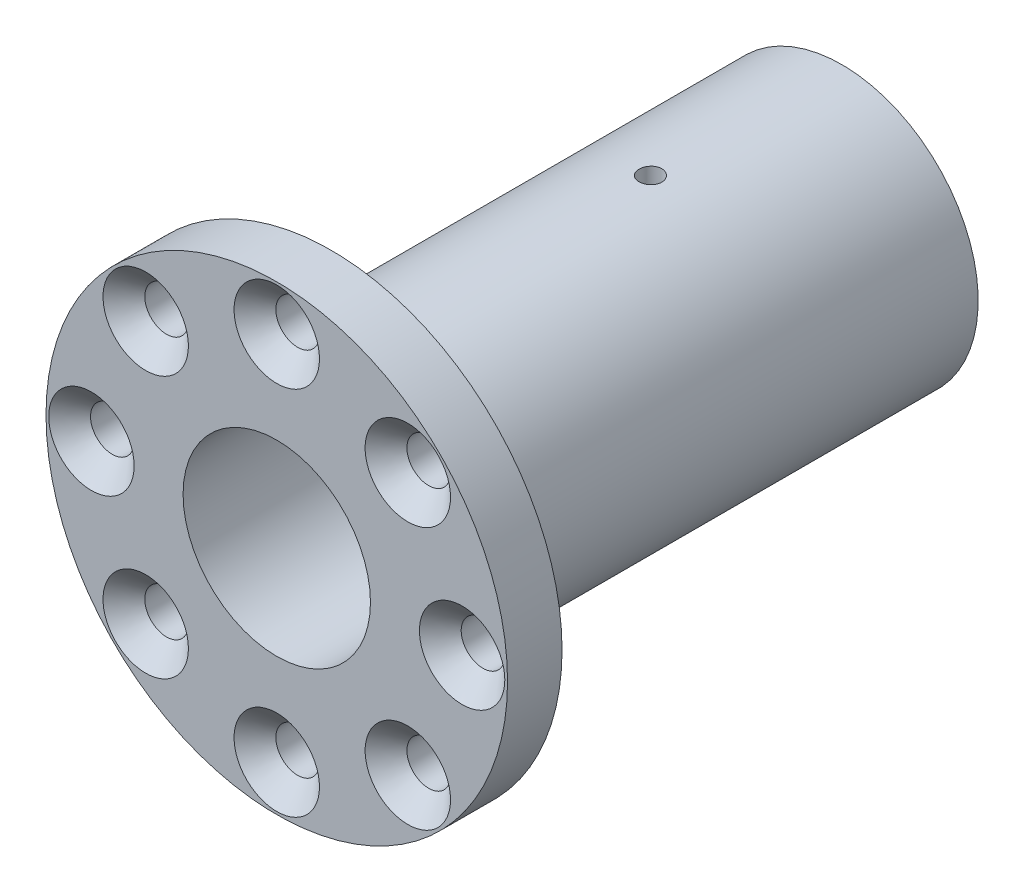
ISO-10303-21;
HEADER;
FILE_DESCRIPTION(('STEP AP214'),'2;1');
FILE_NAME('part.step','',(''),(''),'','','');
FILE_SCHEMA(('AUTOMOTIVE_DESIGN { 1 0 10303 214 1 1 1 1 }'));
ENDSEC;
DATA;
#1=APPLICATION_CONTEXT('core data for automotive mechanical design processes');
#2=APPLICATION_PROTOCOL_DEFINITION('international standard','automotive_design',2000,#1);
#3=PRODUCT_CONTEXT('',#1,'mechanical');
#4=PRODUCT('Part','Part','',(#3));
#5=PRODUCT_RELATED_PRODUCT_CATEGORY('part','',(#4));
#6=PRODUCT_DEFINITION_FORMATION('','',#4);
#7=PRODUCT_DEFINITION_CONTEXT('part definition',#1,'design');
#8=PRODUCT_DEFINITION('design','',#6,#7);
#9=PRODUCT_DEFINITION_SHAPE('','',#8);
#10=(LENGTH_UNIT() NAMED_UNIT(*) SI_UNIT(.MILLI.,.METRE.));
#11=(NAMED_UNIT(*) PLANE_ANGLE_UNIT() SI_UNIT($,.RADIAN.));
#12=(NAMED_UNIT(*) SI_UNIT($,.STERADIAN.) SOLID_ANGLE_UNIT());
#13=UNCERTAINTY_MEASURE_WITH_UNIT(LENGTH_MEASURE(1.E-05),#10,'distance_accuracy_value','');
#14=(GEOMETRIC_REPRESENTATION_CONTEXT(3) GLOBAL_UNCERTAINTY_ASSIGNED_CONTEXT((#13)) GLOBAL_UNIT_ASSIGNED_CONTEXT((#10,
#11,#12)) REPRESENTATION_CONTEXT('',''));
#15=CARTESIAN_POINT('',(0.,0.,0.));
#16=DIRECTION('',(0.,0.,1.));
#17=DIRECTION('',(1.,0.,0.));
#18=AXIS2_PLACEMENT_3D('',#15,#16,#17);
#19=CARTESIAN_POINT('',(0.,0.,61.54));
#20=DIRECTION('',(0.,0.,-1.));
#21=DIRECTION('',(-1.,0.,0.));
#22=AXIS2_PLACEMENT_3D('',#19,#20,#21);
#23=CYLINDRICAL_SURFACE('',#22,25.4);
#24=CARTESIAN_POINT('',(0.,0.,61.54));
#25=DIRECTION('',(0.,0.,-1.));
#26=DIRECTION('',(-1.,0.,0.));
#27=AXIS2_PLACEMENT_3D('',#24,#25,#26);
#28=CIRCLE('',#27,25.4);
#29=CARTESIAN_POINT('',(-25.4,0.,61.54));
#30=VERTEX_POINT('',#29);
#31=EDGE_CURVE('E51',#30,#30,#28,.T.);
#32=ORIENTED_EDGE('',*,*,#31,.T.);
#33=EDGE_LOOP('',(#32));
#34=FACE_BOUND('',#33,.T.);
#35=CARTESIAN_POINT('',(0.,0.,55.54));
#36=DIRECTION('',(0.,0.,-1.));
#37=DIRECTION('',(-1.,0.,0.));
#38=AXIS2_PLACEMENT_3D('',#35,#36,#37);
#39=CIRCLE('',#38,25.4);
#40=CARTESIAN_POINT('',(-25.4,0.,55.54));
#41=VERTEX_POINT('',#40);
#42=EDGE_CURVE('E218',#41,#41,#39,.T.);
#43=ORIENTED_EDGE('',*,*,#42,.F.);
#44=EDGE_LOOP('',(#43));
#45=FACE_BOUND('',#44,.T.);
#46=ADVANCED_FACE('F42',(#34,#45),#23,.T.);
#47=CARTESIAN_POINT('',(25.4,0.,61.54));
#48=DIRECTION('',(0.,0.,1.));
#49=DIRECTION('',(1.,0.,0.));
#50=AXIS2_PLACEMENT_3D('',#47,#48,#49);
#51=PLANE('',#50);
#52=CARTESIAN_POINT('',(0.,20.4,61.54));
#53=DIRECTION('',(0.,0.,1.));
#54=DIRECTION('',(1.,0.,0.));
#55=AXIS2_PLACEMENT_3D('',#52,#53,#54);
#56=CIRCLE('',#55,4.7);
#57=CARTESIAN_POINT('',(4.7,20.4,61.54));
#58=VERTEX_POINT('',#57);
#59=EDGE_CURVE('E391',#58,#58,#56,.T.);
#60=ORIENTED_EDGE('',*,*,#59,.F.);
#61=EDGE_LOOP('',(#60));
#62=FACE_BOUND('',#61,.T.);
#63=CARTESIAN_POINT('',(14.4249783362061,14.4249783362068,61.54));
#64=DIRECTION('',(0.,0.,1.));
#65=DIRECTION('',(1.,0.,0.));
#66=AXIS2_PLACEMENT_3D('',#63,#64,#65);
#67=CIRCLE('',#66,4.7);
#68=CARTESIAN_POINT('',(19.1249783362061,14.4249783362068,61.54));
#69=VERTEX_POINT('',#68);
#70=EDGE_CURVE('E384',#69,#69,#67,.T.);
#71=ORIENTED_EDGE('',*,*,#70,.F.);
#72=EDGE_LOOP('',(#71));
#73=FACE_BOUND('',#72,.T.);
#74=CARTESIAN_POINT('',(20.4000000000017,1.73691033767046E-12,61.54));
#75=DIRECTION('',(0.,0.,1.));
#76=DIRECTION('',(1.,0.,0.));
#77=AXIS2_PLACEMENT_3D('',#74,#75,#76);
#78=CIRCLE('',#77,4.7);
#79=CARTESIAN_POINT('',(25.1000000000017,1.73691033767046E-12,61.54));
#80=VERTEX_POINT('',#79);
#81=EDGE_CURVE('E376',#80,#80,#78,.T.);
#82=ORIENTED_EDGE('',*,*,#81,.F.);
#83=EDGE_LOOP('',(#82));
#84=FACE_BOUND('',#83,.T.);
#85=CARTESIAN_POINT('',(14.4249783362085,-14.4249783362043,61.54));
#86=DIRECTION('',(0.,0.,1.));
#87=DIRECTION('',(1.,0.,0.));
#88=AXIS2_PLACEMENT_3D('',#85,#86,#87);
#89=CIRCLE('',#88,4.7);
#90=CARTESIAN_POINT('',(19.1249783362085,-14.4249783362043,61.54));
#91=VERTEX_POINT('',#90);
#92=EDGE_CURVE('E368',#91,#91,#89,.T.);
#93=ORIENTED_EDGE('',*,*,#92,.F.);
#94=EDGE_LOOP('',(#93));
#95=FACE_BOUND('',#94,.T.);
#96=CARTESIAN_POINT('',(3.47378376064356E-12,-20.4,61.54));
#97=DIRECTION('',(0.,0.,1.));
#98=DIRECTION('',(1.,0.,0.));
#99=AXIS2_PLACEMENT_3D('',#96,#97,#98);
#100=CIRCLE('',#99,4.7);
#101=CARTESIAN_POINT('',(4.70000000000347,-20.4,61.54));
#102=VERTEX_POINT('',#101);
#103=EDGE_CURVE('E361',#102,#102,#100,.T.);
#104=ORIENTED_EDGE('',*,*,#103,.F.);
#105=EDGE_LOOP('',(#104));
#106=FACE_BOUND('',#105,.T.);
#107=CARTESIAN_POINT('',(-14.4249783362026,-14.4249783362068,61.54));
#108=DIRECTION('',(0.,0.,1.));
#109=DIRECTION('',(1.,0.,0.));
#110=AXIS2_PLACEMENT_3D('',#107,#108,#109);
#111=CIRCLE('',#110,4.7);
#112=CARTESIAN_POINT('',(-9.7249783362026,-14.4249783362068,61.54));
#113=VERTEX_POINT('',#112);
#114=EDGE_CURVE('E353',#113,#113,#111,.T.);
#115=ORIENTED_EDGE('',*,*,#114,.F.);
#116=EDGE_LOOP('',(#115));
#117=FACE_BOUND('',#116,.T.);
#118=CARTESIAN_POINT('',(-20.3999999999983,-1.73940861714072E-12,61.54));
#119=DIRECTION('',(0.,0.,1.));
#120=DIRECTION('',(1.,0.,0.));
#121=AXIS2_PLACEMENT_3D('',#118,#119,#120);
#122=CIRCLE('',#121,4.7);
#123=CARTESIAN_POINT('',(-15.6999999999983,-1.73940861714072E-12,61.54));
#124=VERTEX_POINT('',#123);
#125=EDGE_CURVE('E345',#124,#124,#122,.T.);
#126=ORIENTED_EDGE('',*,*,#125,.F.);
#127=EDGE_LOOP('',(#126));
#128=FACE_BOUND('',#127,.T.);
#129=CARTESIAN_POINT('',(-14.4249783362051,14.4249783362043,61.54));
#130=DIRECTION('',(0.,0.,1.));
#131=DIRECTION('',(1.,0.,0.));
#132=AXIS2_PLACEMENT_3D('',#129,#130,#131);
#133=CIRCLE('',#132,4.7);
#134=CARTESIAN_POINT('',(-9.72497833620506,14.4249783362043,61.54));
#135=VERTEX_POINT('',#134);
#136=EDGE_CURVE('E333',#135,#135,#133,.T.);
#137=ORIENTED_EDGE('',*,*,#136,.F.);
#138=EDGE_LOOP('',(#137));
#139=FACE_BOUND('',#138,.T.);
#140=CARTESIAN_POINT('',(0.,0.,61.54));
#141=DIRECTION('',(0.,0.,1.));
#142=DIRECTION('',(1.,0.,0.));
#143=AXIS2_PLACEMENT_3D('',#140,#141,#142);
#144=CIRCLE('',#143,10.3124);
#145=CARTESIAN_POINT('',(10.3124,0.,61.54));
#146=VERTEX_POINT('',#145);
#147=EDGE_CURVE('E177',#146,#146,#144,.T.);
#148=ORIENTED_EDGE('',*,*,#147,.F.);
#149=EDGE_LOOP('',(#148));
#150=FACE_BOUND('',#149,.T.);
#151=ORIENTED_EDGE('',*,*,#31,.F.);
#152=EDGE_LOOP('',(#151));
#153=FACE_BOUND('',#152,.T.);
#154=ADVANCED_FACE('F280',(#62,#73,#84,#95,#106,#117,#128,#139,#150,#153),#51,.T.);
#155=CARTESIAN_POINT('',(0.,0.,55.54));
#156=DIRECTION('',(0.,0.,-1.));
#157=DIRECTION('',(-1.,0.,0.));
#158=AXIS2_PLACEMENT_3D('',#155,#156,#157);
#159=PLANE('',#158);
#160=CARTESIAN_POINT('',(0.,20.4,55.54));
#161=DIRECTION('',(0.,0.,-1.));
#162=DIRECTION('',(-1.,0.,0.));
#163=AXIS2_PLACEMENT_3D('',#160,#161,#162);
#164=CIRCLE('',#163,2.39999999999999);
#165=CARTESIAN_POINT('',(-2.39999999999999,20.4,55.54));
#166=VERTEX_POINT('',#165);
#167=EDGE_CURVE('E45',#166,#166,#164,.T.);
#168=ORIENTED_EDGE('',*,*,#167,.F.);
#169=EDGE_LOOP('',(#168));
#170=FACE_BOUND('',#169,.T.);
#171=CARTESIAN_POINT('',(14.4249783362061,14.4249783362068,55.54));
#172=DIRECTION('',(0.,0.,-1.));
#173=DIRECTION('',(-1.,0.,0.));
#174=AXIS2_PLACEMENT_3D('',#171,#172,#173);
#175=CIRCLE('',#174,2.39999999999999);
#176=CARTESIAN_POINT('',(12.0249783362061,14.4249783362068,55.54));
#177=VERTEX_POINT('',#176);
#178=EDGE_CURVE('E300',#177,#177,#175,.T.);
#179=ORIENTED_EDGE('',*,*,#178,.F.);
#180=EDGE_LOOP('',(#179));
#181=FACE_BOUND('',#180,.T.);
#182=CARTESIAN_POINT('',(20.4000000000017,1.73691033767046E-12,55.54));
#183=DIRECTION('',(0.,0.,-1.));
#184=DIRECTION('',(-1.,0.,0.));
#185=AXIS2_PLACEMENT_3D('',#182,#183,#184);
#186=CIRCLE('',#185,2.39999999999999);
#187=CARTESIAN_POINT('',(18.0000000000017,1.73691033767046E-12,55.54));
#188=VERTEX_POINT('',#187);
#189=EDGE_CURVE('E304',#188,#188,#186,.T.);
#190=ORIENTED_EDGE('',*,*,#189,.F.);
#191=EDGE_LOOP('',(#190));
#192=FACE_BOUND('',#191,.T.);
#193=CARTESIAN_POINT('',(14.4249783362085,-14.4249783362043,55.54));
#194=DIRECTION('',(0.,0.,-1.));
#195=DIRECTION('',(-1.,0.,0.));
#196=AXIS2_PLACEMENT_3D('',#193,#194,#195);
#197=CIRCLE('',#196,2.39999999999999);
#198=CARTESIAN_POINT('',(12.0249783362085,-14.4249783362043,55.54));
#199=VERTEX_POINT('',#198);
#200=EDGE_CURVE('E308',#199,#199,#197,.T.);
#201=ORIENTED_EDGE('',*,*,#200,.F.);
#202=EDGE_LOOP('',(#201));
#203=FACE_BOUND('',#202,.T.);
#204=CARTESIAN_POINT('',(3.47378376064356E-12,-20.4,55.54));
#205=DIRECTION('',(0.,0.,-1.));
#206=DIRECTION('',(-1.,0.,0.));
#207=AXIS2_PLACEMENT_3D('',#204,#205,#206);
#208=CIRCLE('',#207,2.39999999999999);
#209=CARTESIAN_POINT('',(-2.39999999999651,-20.4,55.54));
#210=VERTEX_POINT('',#209);
#211=EDGE_CURVE('E312',#210,#210,#208,.T.);
#212=ORIENTED_EDGE('',*,*,#211,.F.);
#213=EDGE_LOOP('',(#212));
#214=FACE_BOUND('',#213,.T.);
#215=CARTESIAN_POINT('',(-14.4249783362026,-14.4249783362068,55.54));
#216=DIRECTION('',(0.,0.,-1.));
#217=DIRECTION('',(-1.,0.,0.));
#218=AXIS2_PLACEMENT_3D('',#215,#216,#217);
#219=CIRCLE('',#218,2.39999999999999);
#220=CARTESIAN_POINT('',(-16.8249783362026,-14.4249783362068,55.54));
#221=VERTEX_POINT('',#220);
#222=EDGE_CURVE('E316',#221,#221,#219,.T.);
#223=ORIENTED_EDGE('',*,*,#222,.F.);
#224=EDGE_LOOP('',(#223));
#225=FACE_BOUND('',#224,.T.);
#226=CARTESIAN_POINT('',(-20.3999999999983,-1.73940861714072E-12,55.54));
#227=DIRECTION('',(0.,0.,-1.));
#228=DIRECTION('',(-1.,0.,0.));
#229=AXIS2_PLACEMENT_3D('',#226,#227,#228);
#230=CIRCLE('',#229,2.39999999999999);
#231=CARTESIAN_POINT('',(-22.7999999999983,-1.73940861714072E-12,55.54));
#232=VERTEX_POINT('',#231);
#233=EDGE_CURVE('E320',#232,#232,#230,.T.);
#234=ORIENTED_EDGE('',*,*,#233,.F.);
#235=EDGE_LOOP('',(#234));
#236=FACE_BOUND('',#235,.T.);
#237=CARTESIAN_POINT('',(-14.4249783362051,14.4249783362043,55.54));
#238=DIRECTION('',(0.,0.,-1.));
#239=DIRECTION('',(-1.,0.,0.));
#240=AXIS2_PLACEMENT_3D('',#237,#238,#239);
#241=CIRCLE('',#240,2.39999999999999);
#242=CARTESIAN_POINT('',(-16.824978336205,14.4249783362043,55.54));
#243=VERTEX_POINT('',#242);
#244=EDGE_CURVE('E126',#243,#243,#241,.T.);
#245=ORIENTED_EDGE('',*,*,#244,.F.);
#246=EDGE_LOOP('',(#245));
#247=FACE_BOUND('',#246,.T.);
#248=CARTESIAN_POINT('',(0.,0.,55.54));
#249=DIRECTION('',(0.,0.,-1.));
#250=DIRECTION('',(-1.,0.,0.));
#251=AXIS2_PLACEMENT_3D('',#248,#249,#250);
#252=CIRCLE('',#251,15.);
#253=CARTESIAN_POINT('',(-15.,0.,55.54));
#254=VERTEX_POINT('',#253);
#255=EDGE_CURVE('E11',#254,#254,#252,.T.);
#256=ORIENTED_EDGE('',*,*,#255,.F.);
#257=EDGE_LOOP('',(#256));
#258=FACE_BOUND('',#257,.T.);
#259=ORIENTED_EDGE('',*,*,#42,.T.);
#260=EDGE_LOOP('',(#259));
#261=FACE_BOUND('',#260,.T.);
#262=ADVANCED_FACE('F275',(#170,#181,#192,#203,#214,#225,#236,#247,#258,#261),#159,.T.);
#263=CARTESIAN_POINT('',(0.,0.,-0.660000000000001));
#264=DIRECTION('',(0.,0.,1.));
#265=DIRECTION('',(1.,0.,0.));
#266=AXIS2_PLACEMENT_3D('',#263,#264,#265);
#267=CYLINDRICAL_SURFACE('',#266,15.);
#268=CARTESIAN_POINT('',(0.,15.,19.172));
#269=CARTESIAN_POINT('',(0.070082612401505,14.999999317644,19.1720030610329));
#270=CARTESIAN_POINT('',(0.140212933975281,14.9995036067925,19.1779137122638));
#271=CARTESIAN_POINT('',(0.278533213375486,14.9975737791031,19.2014054398189));
#272=CARTESIAN_POINT('',(0.346720881531537,14.9961385991462,19.2189997378811));
#273=CARTESIAN_POINT('',(0.479132528142825,14.9924920155763,19.2653464422617));
#274=CARTESIAN_POINT('',(0.543358725530768,14.9902810512311,19.2940925351373));
#275=CARTESIAN_POINT('',(0.666059041770093,14.9853308468089,19.36191553984));
#276=CARTESIAN_POINT('',(0.724534387356734,14.982591719767,19.4009902418469));
#277=CARTESIAN_POINT('',(0.834237499956986,14.9768847483339,19.4884688332575));
#278=CARTESIAN_POINT('',(0.885448590520199,14.9739164010822,19.5368936049196));
#279=CARTESIAN_POINT('',(0.97902641692069,14.9680897600396,19.6416536198124));
#280=CARTESIAN_POINT('',(1.02139276421438,14.965231471088,19.6979892103783));
#281=CARTESIAN_POINT('',(1.09613490298778,14.9599431582655,19.8170726463738));
#282=CARTESIAN_POINT('',(1.12849604118943,14.9575137647512,19.8798297192535));
#283=CARTESIAN_POINT('',(1.1822155422173,14.9533640556034,20.009910369445));
#284=CARTESIAN_POINT('',(1.20357409939052,14.9516437274454,20.0772338660728));
#285=CARTESIAN_POINT('',(1.23463378727321,14.949111150829,20.2143692398515));
#286=CARTESIAN_POINT('',(1.24436208173721,14.9482967867028,20.2841749249908));
#287=CARTESIAN_POINT('',(1.25196901001928,14.9476616540185,20.4244327549317));
#288=CARTESIAN_POINT('',(1.24984786622442,14.9478408668133,20.4948848875763));
#289=CARTESIAN_POINT('',(1.23383858026856,14.9491707170205,20.6342495818882));
#290=CARTESIAN_POINT('',(1.21997996004757,14.9503189172232,20.7031655613455));
#291=CARTESIAN_POINT('',(1.18093498172867,14.9534535446171,20.8376898342412));
#292=CARTESIAN_POINT('',(1.15574851299598,14.955439979995,20.9032980953673));
#293=CARTESIAN_POINT('',(1.09472973519004,14.9600300588357,21.0294386323476));
#294=CARTESIAN_POINT('',(1.05888418094649,14.9626344693871,21.0899644719844));
#295=CARTESIAN_POINT('',(0.977574304891683,14.9681663357985,21.2041516735248));
#296=CARTESIAN_POINT('',(0.932109788278176,14.9710937982004,21.2578128963715));
#297=CARTESIAN_POINT('',(0.832686977782953,14.9769527551456,21.356919274102));
#298=CARTESIAN_POINT('',(0.778703161738219,14.9798842346883,21.4023388301616));
#299=CARTESIAN_POINT('',(0.663863195464689,14.9854123983729,21.4834746542357));
#300=CARTESIAN_POINT('',(0.603007040644173,14.9880090822911,21.5191909157669));
#301=CARTESIAN_POINT('',(0.476133241584815,14.9925755726205,21.5799047033359));
#302=CARTESIAN_POINT('',(0.410115052261343,14.9945453127181,21.6049010955977));
#303=CARTESIAN_POINT('',(0.274798836274477,14.9976352176475,21.6434476655642));
#304=CARTESIAN_POINT('',(0.205500877711069,14.9987554001111,21.6569980808191));
#305=CARTESIAN_POINT('',(0.0658141252053148,15.0000177117881,21.672235955052));
#306=CARTESIAN_POINT('',(-0.00457078639399386,15.00016275615,21.6739587726336));
#307=CARTESIAN_POINT('',(-0.144628440629128,14.9994662347338,21.6655851742159));
#308=CARTESIAN_POINT('',(-0.214301189901765,14.9986246781584,21.6554888684632));
#309=CARTESIAN_POINT('',(-0.350855945280873,14.9960514730165,21.6237929267374));
#310=CARTESIAN_POINT('',(-0.417741781424651,14.9943210927178,21.6022096799677));
#311=CARTESIAN_POINT('',(-0.54694270635311,14.9901646264044,21.5481692652725));
#312=CARTESIAN_POINT('',(-0.609257722853913,14.9877385293905,21.5157119254269));
#313=CARTESIAN_POINT('',(-0.727709022877381,14.9824553299204,21.4407558134796));
#314=CARTESIAN_POINT('',(-0.783830438151834,14.9795972277342,21.3982336170065));
#315=CARTESIAN_POINT('',(-0.888151368554523,14.9737744829962,21.3043886786869));
#316=CARTESIAN_POINT('',(-0.936350746017976,14.9708098385941,21.2530657839384));
#317=CARTESIAN_POINT('',(-1.02358068181887,14.9650995151978,21.1429228847521));
#318=CARTESIAN_POINT('',(-1.06258816654204,14.9623543984278,21.0840845735033));
#319=CARTESIAN_POINT('',(-1.13016882854939,14.957401896804,20.9606721714207));
#320=CARTESIAN_POINT('',(-1.15874211001245,14.9551945065815,20.8960981378626));
#321=CARTESIAN_POINT('',(-1.2046039718007,14.9515705356118,20.763129011826));
#322=CARTESIAN_POINT('',(-1.22190667681161,14.9501529653579,20.6947388191071));
#323=CARTESIAN_POINT('',(-1.24478221238769,14.9482658211357,20.556011625157));
#324=CARTESIAN_POINT('',(-1.25035526821033,14.9477962289621,20.485674661338));
#325=CARTESIAN_POINT('',(-1.24961070361366,14.9478584743774,20.3452798424739));
#326=CARTESIAN_POINT('',(-1.24332933722173,14.9483872586634,20.2752217909545));
#327=CARTESIAN_POINT('',(-1.21912982911878,14.9503801885288,20.1371593330614));
#328=CARTESIAN_POINT('',(-1.20121166965953,14.951844335535,20.0691549298202));
#329=CARTESIAN_POINT('',(-1.15425638752133,14.9555422141463,19.9371277959167));
#330=CARTESIAN_POINT('',(-1.12521991750816,14.9577759005774,19.8731048317929));
#331=CARTESIAN_POINT('',(-1.05685632368406,14.9627612484384,19.7508364492829));
#332=CARTESIAN_POINT('',(-1.0175293613932,14.9655129017381,19.6925909402333));
#333=CARTESIAN_POINT('',(-0.929564927653057,14.9712341462335,19.5833453262337));
#334=CARTESIAN_POINT('',(-0.880900617176821,14.9742043500718,19.5323668641783));
#335=CARTESIAN_POINT('',(-0.77569153199058,14.980022437621,19.4392810184959));
#336=CARTESIAN_POINT('',(-0.719144853301364,14.9828702915603,19.39717578438));
#337=CARTESIAN_POINT('',(-0.599667216286769,14.9881279355284,19.3229751744781));
#338=CARTESIAN_POINT('',(-0.536724570338173,14.9905369002888,19.2908985766796));
#339=CARTESIAN_POINT('',(-0.406369689994666,14.9946356564538,19.2378102461859));
#340=CARTESIAN_POINT('',(-0.338962694267062,14.9963262741032,19.2167857946399));
#341=CARTESIAN_POINT('',(-0.225965060120847,14.9983638466731,19.1917530218724));
#342=CARTESIAN_POINT('',(-0.181101118048087,14.9989746109619,19.1843554843531));
#343=CARTESIAN_POINT('',(-0.0908314643764523,14.9997929082329,19.1744779879035));
#344=CARTESIAN_POINT('',(-0.0454257542163058,15.0000004422857,19.1719980159169));
#345=CARTESIAN_POINT('',(0.,15.,19.172));
#346=B_SPLINE_CURVE_WITH_KNOTS('',3,(#268,#269,#270,#271,#272,#273,#274,#275,#276,#277,#278,
#279,#280,#281,#282,#283,#284,#285,#286,#287,#288,#289,#290,#291,#292,#293,#294,#295,#296,#297,
#298,#299,#300,#301,#302,#303,#304,#305,#306,#307,#308,#309,#310,#311,#312,#313,#314,#315,#316,
#317,#318,#319,#320,#321,#322,#323,#324,#325,#326,#327,#328,#329,#330,#331,#332,#333,#334,#335,
#336,#337,#338,#339,#340,#341,#342,#343,#344,#345),.UNSPECIFIED.,.T.,.F.,(4,2,2,2,2,2,2,2,2,2,2,
2,2,2,2,2,2,2,2,2,2,2,2,2,2,2,2,2,2,2,2,2,2,2,2,2,2,2,4),(0.,0.210081983500173,
0.420402111247292,0.630603342361191,0.840759636980224,1.05139083598221,1.26203128592414,
1.47297878688864,1.68392256159875,1.89437268539483,2.10481885953273,2.31473728887862,
2.52465776846248,2.73484019686123,2.94502688226074,3.15585563668936,3.36668453198305,
3.57753571988062,3.78838253165668,3.9985987413396,4.20881299017775,4.4187281128848,
4.62864655451714,4.83905843718657,5.04947397589062,5.26041220614001,5.47134833024784,
5.68201959051159,5.89268680498446,6.10271078603158,6.31273508740423,6.52274706184401,
6.73275574012318,6.94337735830797,7.15404994040599,7.3651146632819,7.5759359573973,
7.71210607945825,7.8482758399843),.UNSPECIFIED.);
#347=CARTESIAN_POINT('',(0.,15.,19.172));
#348=VERTEX_POINT('',#347);
#349=EDGE_CURVE('E168',#348,#348,#346,.T.);
#350=ORIENTED_EDGE('',*,*,#349,.T.);
#351=EDGE_LOOP('',(#350));
#352=FACE_BOUND('',#351,.T.);
#353=CARTESIAN_POINT('',(0.,0.,-0.660000000000001));
#354=DIRECTION('',(0.,0.,-1.));
#355=DIRECTION('',(-1.,0.,0.));
#356=AXIS2_PLACEMENT_3D('',#353,#354,#355);
#357=CIRCLE('',#356,15.);
#358=CARTESIAN_POINT('',(-15.,0.,-0.660000000000001));
#359=VERTEX_POINT('',#358);
#360=EDGE_CURVE('E207',#359,#359,#357,.T.);
#361=ORIENTED_EDGE('',*,*,#360,.F.);
#362=EDGE_LOOP('',(#361));
#363=FACE_BOUND('',#362,.T.);
#364=ORIENTED_EDGE('',*,*,#255,.T.);
#365=EDGE_LOOP('',(#364));
#366=FACE_BOUND('',#365,.T.);
#367=ADVANCED_FACE('F235',(#352,#363,#366),#267,.T.);
#368=CARTESIAN_POINT('',(0.,0.,-0.660000000000001));
#369=DIRECTION('',(0.,0.,-1.));
#370=DIRECTION('',(-1.,0.,0.));
#371=AXIS2_PLACEMENT_3D('',#368,#369,#370);
#372=PLANE('',#371);
#373=CARTESIAN_POINT('',(11.4999999999991,-7.61616736356426E-13,-0.660000000000001));
#374=DIRECTION('',(0.,0.,-1.));
#375=DIRECTION('',(-1.,0.,0.));
#376=AXIS2_PLACEMENT_3D('',#373,#374,#375);
#377=CIRCLE('',#376,1.25);
#378=CARTESIAN_POINT('',(10.2499999999991,-7.61616736356426E-13,-0.660000000000001));
#379=VERTEX_POINT('',#378);
#380=EDGE_CURVE('E115',#379,#379,#377,.T.);
#381=ORIENTED_EDGE('',*,*,#380,.F.);
#382=EDGE_LOOP('',(#381));
#383=FACE_BOUND('',#382,.T.);
#384=CARTESIAN_POINT('',(5.74999999999794,-9.95929214352135,-0.660000000000001));
#385=DIRECTION('',(0.,0.,-1.));
#386=DIRECTION('',(-1.,0.,0.));
#387=AXIS2_PLACEMENT_3D('',#384,#385,#386);
#388=CIRCLE('',#387,1.25);
#389=CARTESIAN_POINT('',(4.49999999999794,-9.95929214352135,-0.660000000000001));
#390=VERTEX_POINT('',#389);
#391=EDGE_CURVE('E114',#390,#390,#388,.T.);
#392=ORIENTED_EDGE('',*,*,#391,.F.);
#393=EDGE_LOOP('',(#392));
#394=FACE_BOUND('',#393,.T.);
#395=CARTESIAN_POINT('',(-5.75000000000222,-9.95929214352015,-0.660000000000001));
#396=DIRECTION('',(0.,0.,-1.));
#397=DIRECTION('',(-1.,0.,0.));
#398=AXIS2_PLACEMENT_3D('',#395,#396,#397);
#399=CIRCLE('',#398,1.25);
#400=CARTESIAN_POINT('',(-7.00000000000222,-9.95929214352015,-0.660000000000001));
#401=VERTEX_POINT('',#400);
#402=EDGE_CURVE('E133',#401,#401,#399,.T.);
#403=ORIENTED_EDGE('',*,*,#402,.F.);
#404=EDGE_LOOP('',(#403));
#405=FACE_BOUND('',#404,.T.);
#406=CARTESIAN_POINT('',(-11.5000000000013,1.64225995095778E-12,-0.660000000000001));
#407=DIRECTION('',(0.,0.,-1.));
#408=DIRECTION('',(-1.,0.,0.));
#409=AXIS2_PLACEMENT_3D('',#406,#407,#408);
#410=CIRCLE('',#409,1.25);
#411=CARTESIAN_POINT('',(-12.7500000000013,1.64225995095778E-12,-0.660000000000001));
#412=VERTEX_POINT('',#411);
#413=EDGE_CURVE('E141',#412,#412,#410,.T.);
#414=ORIENTED_EDGE('',*,*,#413,.F.);
#415=EDGE_LOOP('',(#414));
#416=FACE_BOUND('',#415,.T.);
#417=CARTESIAN_POINT('',(-5.75000000000015,9.95929214352223,-0.660000000000001));
#418=DIRECTION('',(0.,0.,-1.));
#419=DIRECTION('',(-1.,0.,0.));
#420=AXIS2_PLACEMENT_3D('',#417,#418,#419);
#421=CIRCLE('',#420,1.25);
#422=CARTESIAN_POINT('',(-7.00000000000015,9.95929214352223,-0.660000000000001));
#423=VERTEX_POINT('',#422);
#424=EDGE_CURVE('E149',#423,#423,#421,.T.);
#425=ORIENTED_EDGE('',*,*,#424,.F.);
#426=EDGE_LOOP('',(#425));
#427=FACE_BOUND('',#426,.T.);
#428=CARTESIAN_POINT('',(5.75000000000002,9.95929214352104,-0.660000000000001));
#429=DIRECTION('',(0.,0.,-1.));
#430=DIRECTION('',(-1.,0.,0.));
#431=AXIS2_PLACEMENT_3D('',#428,#429,#430);
#432=CIRCLE('',#431,1.25);
#433=CARTESIAN_POINT('',(4.50000000000002,9.95929214352104,-0.660000000000001));
#434=VERTEX_POINT('',#433);
#435=EDGE_CURVE('E156',#434,#434,#432,.T.);
#436=ORIENTED_EDGE('',*,*,#435,.F.);
#437=EDGE_LOOP('',(#436));
#438=FACE_BOUND('',#437,.T.);
#439=CARTESIAN_POINT('',(0.,0.,-0.660000000000001));
#440=DIRECTION('',(0.,0.,1.));
#441=DIRECTION('',(1.,0.,0.));
#442=AXIS2_PLACEMENT_3D('',#439,#440,#441);
#443=CIRCLE('',#442,7.01039999999999);
#444=CARTESIAN_POINT('',(-2.5,6.54948151841044,-0.660000000000001));
#445=VERTEX_POINT('',#444);
#446=CARTESIAN_POINT('',(2.5,6.54948151841044,-0.660000000000001));
#447=VERTEX_POINT('',#446);
#448=EDGE_CURVE('E181',#445,#447,#443,.T.);
#449=ORIENTED_EDGE('',*,*,#448,.T.);
#450=DIRECTION('',(0.,-1.,0.));
#451=VECTOR('',#450,1.);
#452=CARTESIAN_POINT('',(2.5,9.05849989544415,-0.660000000000001));
#453=LINE('',#452,#451);
#454=CARTESIAN_POINT('',(2.5,9.05849989544415,-0.660000000000001));
#455=VERTEX_POINT('',#454);
#456=EDGE_CURVE('E188',#455,#447,#453,.T.);
#457=ORIENTED_EDGE('',*,*,#456,.F.);
#458=DIRECTION('',(1.,0.,0.));
#459=VECTOR('',#458,1.);
#460=CARTESIAN_POINT('',(-2.5,9.05849989544415,-0.660000000000001));
#461=LINE('',#460,#459);
#462=CARTESIAN_POINT('',(-2.5,9.05849989544415,-0.660000000000001));
#463=VERTEX_POINT('',#462);
#464=EDGE_CURVE('E197',#463,#455,#461,.T.);
#465=ORIENTED_EDGE('',*,*,#464,.F.);
#466=DIRECTION('',(0.,1.,0.));
#467=VECTOR('',#466,1.);
#468=CARTESIAN_POINT('',(-2.5,6.54948151841044,-0.660000000000001));
#469=LINE('',#468,#467);
#470=EDGE_CURVE('E59',#445,#463,#469,.T.);
#471=ORIENTED_EDGE('',*,*,#470,.F.);
#472=EDGE_LOOP('',(#449,#457,#465,#471));
#473=FACE_BOUND('',#472,.T.);
#474=ORIENTED_EDGE('',*,*,#360,.T.);
#475=EDGE_LOOP('',(#474));
#476=FACE_BOUND('',#475,.T.);
#477=ADVANCED_FACE('F269',(#383,#394,#405,#416,#427,#438,#473,#476),#372,.T.);
#478=CARTESIAN_POINT('',(-2.5,6.54948151841044,23.44));
#479=DIRECTION('',(-1.,0.,0.));
#480=DIRECTION('',(0.,0.,1.));
#481=AXIS2_PLACEMENT_3D('',#478,#479,#480);
#482=PLANE('',#481);
#483=ORIENTED_EDGE('',*,*,#470,.T.);
#484=DIRECTION('',(0.,0.,-1.));
#485=VECTOR('',#484,1.);
#486=CARTESIAN_POINT('',(-2.5,9.05849989544415,23.44));
#487=LINE('',#486,#485);
#488=CARTESIAN_POINT('',(-2.5,9.05849989544415,23.44));
#489=VERTEX_POINT('',#488);
#490=EDGE_CURVE('E194',#489,#463,#487,.T.);
#491=ORIENTED_EDGE('',*,*,#490,.F.);
#492=DIRECTION('',(0.,1.,0.));
#493=VECTOR('',#492,1.);
#494=CARTESIAN_POINT('',(-2.5,6.54948151841044,23.44));
#495=LINE('',#494,#493);
#496=CARTESIAN_POINT('',(-2.5,6.54948151841044,23.44));
#497=VERTEX_POINT('',#496);
#498=EDGE_CURVE('E68',#497,#489,#495,.T.);
#499=ORIENTED_EDGE('',*,*,#498,.F.);
#500=DIRECTION('',(0.,0.,-1.));
#501=VECTOR('',#500,1.);
#502=CARTESIAN_POINT('',(-2.5,6.54948151841044,23.44));
#503=LINE('',#502,#501);
#504=EDGE_CURVE('E204',#497,#445,#503,.T.);
#505=ORIENTED_EDGE('',*,*,#504,.T.);
#506=EDGE_LOOP('',(#483,#491,#499,#505));
#507=FACE_BOUND('',#506,.T.);
#508=ADVANCED_FACE('F263',(#507),#482,.F.);
#509=CARTESIAN_POINT('',(2.5,9.05849989544415,23.44));
#510=DIRECTION('',(1.,0.,0.));
#511=DIRECTION('',(0.,0.,-1.));
#512=AXIS2_PLACEMENT_3D('',#509,#510,#511);
#513=PLANE('',#512);
#514=ORIENTED_EDGE('',*,*,#456,.T.);
#515=DIRECTION('',(0.,0.,-1.));
#516=VECTOR('',#515,1.);
#517=CARTESIAN_POINT('',(2.5,6.54948151841044,23.44));
#518=LINE('',#517,#516);
#519=CARTESIAN_POINT('',(2.5,6.54948151841044,23.44));
#520=VERTEX_POINT('',#519);
#521=EDGE_CURVE('E208',#520,#447,#518,.T.);
#522=ORIENTED_EDGE('',*,*,#521,.F.);
#523=DIRECTION('',(0.,-1.,0.));
#524=VECTOR('',#523,1.);
#525=CARTESIAN_POINT('',(2.5,9.05849989544415,23.44));
#526=LINE('',#525,#524);
#527=CARTESIAN_POINT('',(2.5,9.05849989544415,23.44));
#528=VERTEX_POINT('',#527);
#529=EDGE_CURVE('E191',#528,#520,#526,.T.);
#530=ORIENTED_EDGE('',*,*,#529,.F.);
#531=DIRECTION('',(0.,0.,-1.));
#532=VECTOR('',#531,1.);
#533=CARTESIAN_POINT('',(2.5,9.05849989544415,23.44));
#534=LINE('',#533,#532);
#535=EDGE_CURVE('E211',#528,#455,#534,.T.);
#536=ORIENTED_EDGE('',*,*,#535,.T.);
#537=EDGE_LOOP('',(#514,#522,#530,#536));
#538=FACE_BOUND('',#537,.T.);
#539=ADVANCED_FACE('F260',(#538),#513,.F.);
#540=CARTESIAN_POINT('',(-2.5,9.05849989544415,23.44));
#541=DIRECTION('',(0.,1.,0.));
#542=DIRECTION('',(0.,0.,1.));
#543=AXIS2_PLACEMENT_3D('',#540,#541,#542);
#544=PLANE('',#543);
#545=CARTESIAN_POINT('',(0.,9.05849989544415,20.422));
#546=DIRECTION('',(0.,-1.,0.));
#547=DIRECTION('',(0.,0.,-1.));
#548=AXIS2_PLACEMENT_3D('',#545,#546,#547);
#549=CIRCLE('',#548,1.25);
#550=CARTESIAN_POINT('',(0.,9.05849989544415,19.172));
#551=VERTEX_POINT('',#550);
#552=EDGE_CURVE('E164',#551,#551,#549,.T.);
#553=ORIENTED_EDGE('',*,*,#552,.F.);
#554=EDGE_LOOP('',(#553));
#555=FACE_BOUND('',#554,.T.);
#556=ORIENTED_EDGE('',*,*,#464,.T.);
#557=ORIENTED_EDGE('',*,*,#535,.F.);
#558=DIRECTION('',(1.,0.,0.));
#559=VECTOR('',#558,1.);
#560=CARTESIAN_POINT('',(-2.5,9.05849989544415,23.44));
#561=LINE('',#560,#559);
#562=EDGE_CURVE('E187',#489,#528,#561,.T.);
#563=ORIENTED_EDGE('',*,*,#562,.F.);
#564=ORIENTED_EDGE('',*,*,#490,.T.);
#565=EDGE_LOOP('',(#556,#557,#563,#564));
#566=FACE_BOUND('',#565,.T.);
#567=ADVANCED_FACE('F252',(#555,#566),#544,.F.);
#568=CARTESIAN_POINT('',(10.3124,0.,23.44));
#569=DIRECTION('',(0.,0.,-1.));
#570=DIRECTION('',(-1.,0.,0.));
#571=AXIS2_PLACEMENT_3D('',#568,#569,#570);
#572=PLANE('',#571);
#573=CARTESIAN_POINT('',(0.,0.,23.44));
#574=DIRECTION('',(0.,0.,1.));
#575=DIRECTION('',(1.,0.,0.));
#576=AXIS2_PLACEMENT_3D('',#573,#574,#575);
#577=CIRCLE('',#576,10.3124);
#578=CARTESIAN_POINT('',(10.3124,0.,23.44));
#579=VERTEX_POINT('',#578);
#580=EDGE_CURVE('E173',#579,#579,#577,.T.);
#581=ORIENTED_EDGE('',*,*,#580,.T.);
#582=EDGE_LOOP('',(#581));
#583=FACE_BOUND('',#582,.T.);
#584=ORIENTED_EDGE('',*,*,#562,.T.);
#585=ORIENTED_EDGE('',*,*,#529,.T.);
#586=CARTESIAN_POINT('',(0.,0.,23.44));
#587=DIRECTION('',(0.,0.,1.));
#588=DIRECTION('',(1.,0.,0.));
#589=AXIS2_PLACEMENT_3D('',#586,#587,#588);
#590=CIRCLE('',#589,7.01039999999999);
#591=EDGE_CURVE('E169',#497,#520,#590,.T.);
#592=ORIENTED_EDGE('',*,*,#591,.F.);
#593=ORIENTED_EDGE('',*,*,#498,.T.);
#594=EDGE_LOOP('',(#584,#585,#592,#593));
#595=FACE_BOUND('',#594,.T.);
#596=ADVANCED_FACE('F248',(#583,#595),#572,.F.);
#597=CARTESIAN_POINT('',(0.,0.,-0.660000000000001));
#598=DIRECTION('',(0.,0.,1.));
#599=DIRECTION('',(1.,0.,0.));
#600=AXIS2_PLACEMENT_3D('',#597,#598,#599);
#601=CYLINDRICAL_SURFACE('',#600,7.01039999999999);
#602=ORIENTED_EDGE('',*,*,#591,.T.);
#603=ORIENTED_EDGE('',*,*,#521,.T.);
#604=ORIENTED_EDGE('',*,*,#448,.F.);
#605=ORIENTED_EDGE('',*,*,#504,.F.);
#606=EDGE_LOOP('',(#602,#603,#604,#605));
#607=FACE_BOUND('',#606,.T.);
#608=ADVANCED_FACE('F251',(#607),#601,.F.);
#609=CARTESIAN_POINT('',(0.,0.,-0.660000000000001));
#610=DIRECTION('',(0.,0.,1.));
#611=DIRECTION('',(1.,0.,0.));
#612=AXIS2_PLACEMENT_3D('',#609,#610,#611);
#613=CYLINDRICAL_SURFACE('',#612,10.3124);
#614=ORIENTED_EDGE('',*,*,#580,.F.);
#615=EDGE_LOOP('',(#614));
#616=FACE_BOUND('',#615,.T.);
#617=ORIENTED_EDGE('',*,*,#147,.T.);
#618=EDGE_LOOP('',(#617));
#619=FACE_BOUND('',#618,.T.);
#620=ADVANCED_FACE('F245',(#616,#619),#613,.F.);
#621=CARTESIAN_POINT('',(0.,9.05849989544415,20.422));
#622=DIRECTION('',(0.,-1.,0.));
#623=DIRECTION('',(0.,0.,-1.));
#624=AXIS2_PLACEMENT_3D('',#621,#622,#623);
#625=CYLINDRICAL_SURFACE('',#624,1.25);
#626=ORIENTED_EDGE('',*,*,#552,.T.);
#627=EDGE_LOOP('',(#626));
#628=FACE_BOUND('',#627,.T.);
#629=ORIENTED_EDGE('',*,*,#349,.F.);
#630=EDGE_LOOP('',(#629));
#631=FACE_BOUND('',#630,.T.);
#632=ADVANCED_FACE('F239',(#628,#631),#625,.F.);
#633=CARTESIAN_POINT('',(5.75000000000002,9.95929214352104,11.34));
#634=DIRECTION('',(0.,0.,-1.));
#635=DIRECTION('',(-1.,0.,0.));
#636=AXIS2_PLACEMENT_3D('',#633,#634,#635);
#637=CONICAL_SURFACE('',#636,1.25,1.02974425867665);
#638=CARTESIAN_POINT('',(5.75000000000001,9.95929214352104,12.0910757737844));
#639=VERTEX_POINT('',#638);
#640=VERTEX_LOOP('',#639);
#641=FACE_BOUND('',#640,.T.);
#642=CARTESIAN_POINT('',(5.75000000000002,9.95929214352104,11.34));
#643=DIRECTION('',(0.,0.,-1.));
#644=DIRECTION('',(-1.,0.,0.));
#645=AXIS2_PLACEMENT_3D('',#642,#643,#644);
#646=CIRCLE('',#645,1.25);
#647=CARTESIAN_POINT('',(4.50000000000002,9.95929214352104,11.34));
#648=VERTEX_POINT('',#647);
#649=EDGE_CURVE('E160',#648,#648,#646,.T.);
#650=ORIENTED_EDGE('',*,*,#649,.T.);
#651=EDGE_LOOP('',(#650));
#652=FACE_BOUND('',#651,.T.);
#653=ADVANCED_FACE('F244',(#641,#652),#637,.F.);
#654=CARTESIAN_POINT('',(5.75000000000002,9.95929214352104,-0.660000000000001));
#655=DIRECTION('',(0.,0.,-1.));
#656=DIRECTION('',(-1.,0.,0.));
#657=AXIS2_PLACEMENT_3D('',#654,#655,#656);
#658=CYLINDRICAL_SURFACE('',#657,1.25);
#659=ORIENTED_EDGE('',*,*,#649,.F.);
#660=EDGE_LOOP('',(#659));
#661=FACE_BOUND('',#660,.T.);
#662=ORIENTED_EDGE('',*,*,#435,.T.);
#663=EDGE_LOOP('',(#662));
#664=FACE_BOUND('',#663,.T.);
#665=ADVANCED_FACE('F464',(#661,#664),#658,.F.);
#666=CARTESIAN_POINT('',(-5.75000000000015,9.95929214352223,11.34));
#667=DIRECTION('',(0.,0.,-1.));
#668=DIRECTION('',(-1.,0.,0.));
#669=AXIS2_PLACEMENT_3D('',#666,#667,#668);
#670=CONICAL_SURFACE('',#669,1.25,1.02974425867665);
#671=CARTESIAN_POINT('',(-5.75000000000015,9.95929214352223,12.0910757737844));
#672=VERTEX_POINT('',#671);
#673=VERTEX_LOOP('',#672);
#674=FACE_BOUND('',#673,.T.);
#675=CARTESIAN_POINT('',(-5.75000000000015,9.95929214352223,11.34));
#676=DIRECTION('',(0.,0.,-1.));
#677=DIRECTION('',(-1.,0.,0.));
#678=AXIS2_PLACEMENT_3D('',#675,#676,#677);
#679=CIRCLE('',#678,1.25);
#680=CARTESIAN_POINT('',(-7.00000000000015,9.95929214352223,11.34));
#681=VERTEX_POINT('',#680);
#682=EDGE_CURVE('E153',#681,#681,#679,.T.);
#683=ORIENTED_EDGE('',*,*,#682,.T.);
#684=EDGE_LOOP('',(#683));
#685=FACE_BOUND('',#684,.T.);
#686=ADVANCED_FACE('F461',(#674,#685),#670,.F.);
#687=CARTESIAN_POINT('',(-5.75000000000015,9.95929214352223,-0.660000000000001));
#688=DIRECTION('',(0.,0.,-1.));
#689=DIRECTION('',(-1.,0.,0.));
#690=AXIS2_PLACEMENT_3D('',#687,#688,#689);
#691=CYLINDRICAL_SURFACE('',#690,1.25);
#692=ORIENTED_EDGE('',*,*,#682,.F.);
#693=EDGE_LOOP('',(#692));
#694=FACE_BOUND('',#693,.T.);
#695=ORIENTED_EDGE('',*,*,#424,.T.);
#696=EDGE_LOOP('',(#695));
#697=FACE_BOUND('',#696,.T.);
#698=ADVANCED_FACE('F457',(#694,#697),#691,.F.);
#699=CARTESIAN_POINT('',(-11.5000000000013,1.64225995095778E-12,11.34));
#700=DIRECTION('',(0.,0.,-1.));
#701=DIRECTION('',(-1.,0.,0.));
#702=AXIS2_PLACEMENT_3D('',#699,#700,#701);
#703=CONICAL_SURFACE('',#702,1.25,1.02974425867665);
#704=CARTESIAN_POINT('',(-11.5000000000013,1.64225995095778E-12,12.0910757737844));
#705=VERTEX_POINT('',#704);
#706=VERTEX_LOOP('',#705);
#707=FACE_BOUND('',#706,.T.);
#708=CARTESIAN_POINT('',(-11.5000000000013,1.64225995095778E-12,11.34));
#709=DIRECTION('',(0.,0.,-1.));
#710=DIRECTION('',(-1.,0.,0.));
#711=AXIS2_PLACEMENT_3D('',#708,#709,#710);
#712=CIRCLE('',#711,1.25);
#713=CARTESIAN_POINT('',(-12.7500000000013,1.64225995095778E-12,11.34));
#714=VERTEX_POINT('',#713);
#715=EDGE_CURVE('E145',#714,#714,#712,.T.);
#716=ORIENTED_EDGE('',*,*,#715,.T.);
#717=EDGE_LOOP('',(#716));
#718=FACE_BOUND('',#717,.T.);
#719=ADVANCED_FACE('F453',(#707,#718),#703,.F.);
#720=CARTESIAN_POINT('',(-11.5000000000013,1.64225995095778E-12,-0.660000000000001));
#721=DIRECTION('',(0.,0.,-1.));
#722=DIRECTION('',(-1.,0.,0.));
#723=AXIS2_PLACEMENT_3D('',#720,#721,#722);
#724=CYLINDRICAL_SURFACE('',#723,1.25);
#725=ORIENTED_EDGE('',*,*,#715,.F.);
#726=EDGE_LOOP('',(#725));
#727=FACE_BOUND('',#726,.T.);
#728=ORIENTED_EDGE('',*,*,#413,.T.);
#729=EDGE_LOOP('',(#728));
#730=FACE_BOUND('',#729,.T.);
#731=ADVANCED_FACE('F449',(#727,#730),#724,.F.);
#732=CARTESIAN_POINT('',(-5.75000000000222,-9.95929214352015,11.34));
#733=DIRECTION('',(0.,0.,-1.));
#734=DIRECTION('',(-1.,0.,0.));
#735=AXIS2_PLACEMENT_3D('',#732,#733,#734);
#736=CONICAL_SURFACE('',#735,1.25,1.02974425867665);
#737=CARTESIAN_POINT('',(-5.75000000000223,-9.95929214352015,12.0910757737844));
#738=VERTEX_POINT('',#737);
#739=VERTEX_LOOP('',#738);
#740=FACE_BOUND('',#739,.T.);
#741=CARTESIAN_POINT('',(-5.75000000000222,-9.95929214352015,11.34));
#742=DIRECTION('',(0.,0.,-1.));
#743=DIRECTION('',(-1.,0.,0.));
#744=AXIS2_PLACEMENT_3D('',#741,#742,#743);
#745=CIRCLE('',#744,1.25);
#746=CARTESIAN_POINT('',(-7.00000000000222,-9.95929214352015,11.34));
#747=VERTEX_POINT('',#746);
#748=EDGE_CURVE('E137',#747,#747,#745,.T.);
#749=ORIENTED_EDGE('',*,*,#748,.T.);
#750=EDGE_LOOP('',(#749));
#751=FACE_BOUND('',#750,.T.);
#752=ADVANCED_FACE('F445',(#740,#751),#736,.F.);
#753=CARTESIAN_POINT('',(-5.75000000000222,-9.95929214352015,-0.660000000000001));
#754=DIRECTION('',(0.,0.,-1.));
#755=DIRECTION('',(-1.,0.,0.));
#756=AXIS2_PLACEMENT_3D('',#753,#754,#755);
#757=CYLINDRICAL_SURFACE('',#756,1.25);
#758=ORIENTED_EDGE('',*,*,#748,.F.);
#759=EDGE_LOOP('',(#758));
#760=FACE_BOUND('',#759,.T.);
#761=ORIENTED_EDGE('',*,*,#402,.T.);
#762=EDGE_LOOP('',(#761));
#763=FACE_BOUND('',#762,.T.);
#764=ADVANCED_FACE('F441',(#760,#763),#757,.F.);
#765=CARTESIAN_POINT('',(5.74999999999794,-9.95929214352135,11.34));
#766=DIRECTION('',(0.,0.,-1.));
#767=DIRECTION('',(-1.,0.,0.));
#768=AXIS2_PLACEMENT_3D('',#765,#766,#767);
#769=CONICAL_SURFACE('',#768,1.25,1.02974425867665);
#770=CARTESIAN_POINT('',(5.74999999999794,-9.95929214352135,12.0910757737844));
#771=VERTEX_POINT('',#770);
#772=VERTEX_LOOP('',#771);
#773=FACE_BOUND('',#772,.T.);
#774=CARTESIAN_POINT('',(5.74999999999794,-9.95929214352135,11.34));
#775=DIRECTION('',(0.,0.,-1.));
#776=DIRECTION('',(-1.,0.,0.));
#777=AXIS2_PLACEMENT_3D('',#774,#775,#776);
#778=CIRCLE('',#777,1.25);
#779=CARTESIAN_POINT('',(4.49999999999794,-9.95929214352135,11.34));
#780=VERTEX_POINT('',#779);
#781=EDGE_CURVE('E122',#780,#780,#778,.T.);
#782=ORIENTED_EDGE('',*,*,#781,.T.);
#783=EDGE_LOOP('',(#782));
#784=FACE_BOUND('',#783,.T.);
#785=ADVANCED_FACE('F437',(#773,#784),#769,.F.);
#786=CARTESIAN_POINT('',(5.74999999999794,-9.95929214352135,-0.660000000000001));
#787=DIRECTION('',(0.,0.,-1.));
#788=DIRECTION('',(-1.,0.,0.));
#789=AXIS2_PLACEMENT_3D('',#786,#787,#788);
#790=CYLINDRICAL_SURFACE('',#789,1.25);
#791=ORIENTED_EDGE('',*,*,#781,.F.);
#792=EDGE_LOOP('',(#791));
#793=FACE_BOUND('',#792,.T.);
#794=ORIENTED_EDGE('',*,*,#391,.T.);
#795=EDGE_LOOP('',(#794));
#796=FACE_BOUND('',#795,.T.);
#797=ADVANCED_FACE('F107',(#793,#796),#790,.F.);
#798=CARTESIAN_POINT('',(11.4999999999991,-7.61616736356426E-13,11.34));
#799=DIRECTION('',(0.,0.,-1.));
#800=DIRECTION('',(-1.,0.,0.));
#801=AXIS2_PLACEMENT_3D('',#798,#799,#800);
#802=CONICAL_SURFACE('',#801,1.25,1.02974425867665);
#803=CARTESIAN_POINT('',(11.4999999999991,-7.61616736356426E-13,12.0910757737844));
#804=VERTEX_POINT('',#803);
#805=VERTEX_LOOP('',#804);
#806=FACE_BOUND('',#805,.T.);
#807=CARTESIAN_POINT('',(11.4999999999991,-7.61616736356426E-13,11.34));
#808=DIRECTION('',(0.,0.,-1.));
#809=DIRECTION('',(-1.,0.,0.));
#810=AXIS2_PLACEMENT_3D('',#807,#808,#809);
#811=CIRCLE('',#810,1.25);
#812=CARTESIAN_POINT('',(10.2499999999991,-7.61616736356426E-13,11.34));
#813=VERTEX_POINT('',#812);
#814=EDGE_CURVE('E111',#813,#813,#811,.T.);
#815=ORIENTED_EDGE('',*,*,#814,.T.);
#816=EDGE_LOOP('',(#815));
#817=FACE_BOUND('',#816,.T.);
#818=ADVANCED_FACE('F103',(#806,#817),#802,.F.);
#819=CARTESIAN_POINT('',(11.4999999999991,-7.61616736356426E-13,-0.660000000000001));
#820=DIRECTION('',(0.,0.,-1.));
#821=DIRECTION('',(-1.,0.,0.));
#822=AXIS2_PLACEMENT_3D('',#819,#820,#821);
#823=CYLINDRICAL_SURFACE('',#822,1.25);
#824=ORIENTED_EDGE('',*,*,#814,.F.);
#825=EDGE_LOOP('',(#824));
#826=FACE_BOUND('',#825,.T.);
#827=ORIENTED_EDGE('',*,*,#380,.T.);
#828=EDGE_LOOP('',(#827));
#829=FACE_BOUND('',#828,.T.);
#830=ADVANCED_FACE('F106',(#826,#829),#823,.F.);
#831=CARTESIAN_POINT('',(-14.4249783362051,14.4249783362043,61.54));
#832=DIRECTION('',(0.,0.,1.));
#833=DIRECTION('',(1.,0.,0.));
#834=AXIS2_PLACEMENT_3D('',#831,#832,#833);
#835=CYLINDRICAL_SURFACE('',#834,2.39999999999999);
#836=ORIENTED_EDGE('',*,*,#244,.T.);
#837=EDGE_LOOP('',(#836));
#838=FACE_BOUND('',#837,.T.);
#839=CARTESIAN_POINT('',(-14.4249783362051,14.4249783362043,59.24));
#840=DIRECTION('',(0.,0.,1.));
#841=DIRECTION('',(1.,0.,0.));
#842=AXIS2_PLACEMENT_3D('',#839,#840,#841);
#843=CIRCLE('',#842,2.39999999999999);
#844=CARTESIAN_POINT('',(-12.0249783362051,14.4249783362043,59.24));
#845=VERTEX_POINT('',#844);
#846=EDGE_CURVE('E328',#845,#845,#843,.T.);
#847=ORIENTED_EDGE('',*,*,#846,.T.);
#848=EDGE_LOOP('',(#847));
#849=FACE_BOUND('',#848,.T.);
#850=ADVANCED_FACE('F420',(#838,#849),#835,.F.);
#851=CARTESIAN_POINT('',(-14.4249783362051,14.4249783362043,61.54));
#852=DIRECTION('',(0.,0.,1.));
#853=DIRECTION('',(1.,0.,0.));
#854=AXIS2_PLACEMENT_3D('',#851,#852,#853);
#855=CONICAL_SURFACE('',#854,4.7,0.785398163397448);
#856=ORIENTED_EDGE('',*,*,#846,.F.);
#857=EDGE_LOOP('',(#856));
#858=FACE_BOUND('',#857,.T.);
#859=ORIENTED_EDGE('',*,*,#136,.T.);
#860=EDGE_LOOP('',(#859));
#861=FACE_BOUND('',#860,.T.);
#862=ADVANCED_FACE('F417',(#858,#861),#855,.F.);
#863=CARTESIAN_POINT('',(-20.3999999999983,-1.73940861714072E-12,61.54));
#864=DIRECTION('',(0.,0.,1.));
#865=DIRECTION('',(1.,0.,0.));
#866=AXIS2_PLACEMENT_3D('',#863,#864,#865);
#867=CYLINDRICAL_SURFACE('',#866,2.39999999999999);
#868=ORIENTED_EDGE('',*,*,#233,.T.);
#869=EDGE_LOOP('',(#868));
#870=FACE_BOUND('',#869,.T.);
#871=CARTESIAN_POINT('',(-20.3999999999983,-1.73940861714072E-12,59.24));
#872=DIRECTION('',(0.,0.,1.));
#873=DIRECTION('',(1.,0.,0.));
#874=AXIS2_PLACEMENT_3D('',#871,#872,#873);
#875=CIRCLE('',#874,2.39999999999999);
#876=CARTESIAN_POINT('',(-17.9999999999983,-1.73940861714072E-12,59.24));
#877=VERTEX_POINT('',#876);
#878=EDGE_CURVE('E342',#877,#877,#875,.T.);
#879=ORIENTED_EDGE('',*,*,#878,.T.);
#880=EDGE_LOOP('',(#879));
#881=FACE_BOUND('',#880,.T.);
#882=ADVANCED_FACE('F419',(#870,#881),#867,.F.);
#883=CARTESIAN_POINT('',(-20.3999999999983,-1.73940861714072E-12,61.54));
#884=DIRECTION('',(0.,0.,1.));
#885=DIRECTION('',(1.,0.,0.));
#886=AXIS2_PLACEMENT_3D('',#883,#884,#885);
#887=CONICAL_SURFACE('',#886,4.7,0.785398163397447);
#888=ORIENTED_EDGE('',*,*,#878,.F.);
#889=EDGE_LOOP('',(#888));
#890=FACE_BOUND('',#889,.T.);
#891=ORIENTED_EDGE('',*,*,#125,.T.);
#892=EDGE_LOOP('',(#891));
#893=FACE_BOUND('',#892,.T.);
#894=ADVANCED_FACE('F427',(#890,#893),#887,.F.);
#895=CARTESIAN_POINT('',(-14.4249783362026,-14.4249783362068,61.54));
#896=DIRECTION('',(0.,0.,1.));
#897=DIRECTION('',(1.,0.,0.));
#898=AXIS2_PLACEMENT_3D('',#895,#896,#897);
#899=CYLINDRICAL_SURFACE('',#898,2.39999999999999);
#900=ORIENTED_EDGE('',*,*,#222,.T.);
#901=EDGE_LOOP('',(#900));
#902=FACE_BOUND('',#901,.T.);
#903=CARTESIAN_POINT('',(-14.4249783362026,-14.4249783362068,59.24));
#904=DIRECTION('',(0.,0.,1.));
#905=DIRECTION('',(1.,0.,0.));
#906=AXIS2_PLACEMENT_3D('',#903,#904,#905);
#907=CIRCLE('',#906,2.39999999999999);
#908=CARTESIAN_POINT('',(-12.0249783362026,-14.4249783362068,59.24));
#909=VERTEX_POINT('',#908);
#910=EDGE_CURVE('E349',#909,#909,#907,.T.);
#911=ORIENTED_EDGE('',*,*,#910,.T.);
#912=EDGE_LOOP('',(#911));
#913=FACE_BOUND('',#912,.T.);
#914=ADVANCED_FACE('F715',(#902,#913),#899,.F.);
#915=CARTESIAN_POINT('',(-14.4249783362026,-14.4249783362068,61.54));
#916=DIRECTION('',(0.,0.,1.));
#917=DIRECTION('',(1.,0.,0.));
#918=AXIS2_PLACEMENT_3D('',#915,#916,#917);
#919=CONICAL_SURFACE('',#918,4.7,0.785398163397448);
#920=ORIENTED_EDGE('',*,*,#910,.F.);
#921=EDGE_LOOP('',(#920));
#922=FACE_BOUND('',#921,.T.);
#923=ORIENTED_EDGE('',*,*,#114,.T.);
#924=EDGE_LOOP('',(#923));
#925=FACE_BOUND('',#924,.T.);
#926=ADVANCED_FACE('F726',(#922,#925),#919,.F.);
#927=CARTESIAN_POINT('',(3.47378376064356E-12,-20.4,61.54));
#928=DIRECTION('',(0.,0.,1.));
#929=DIRECTION('',(1.,0.,0.));
#930=AXIS2_PLACEMENT_3D('',#927,#928,#929);
#931=CYLINDRICAL_SURFACE('',#930,2.39999999999999);
#932=ORIENTED_EDGE('',*,*,#211,.T.);
#933=EDGE_LOOP('',(#932));
#934=FACE_BOUND('',#933,.T.);
#935=CARTESIAN_POINT('',(3.47378376064356E-12,-20.4,59.24));
#936=DIRECTION('',(0.,0.,1.));
#937=DIRECTION('',(1.,0.,0.));
#938=AXIS2_PLACEMENT_3D('',#935,#936,#937);
#939=CIRCLE('',#938,2.39999999999999);
#940=CARTESIAN_POINT('',(2.40000000000347,-20.4,59.24));
#941=VERTEX_POINT('',#940);
#942=EDGE_CURVE('E357',#941,#941,#939,.T.);
#943=ORIENTED_EDGE('',*,*,#942,.T.);
#944=EDGE_LOOP('',(#943));
#945=FACE_BOUND('',#944,.T.);
#946=ADVANCED_FACE('F738',(#934,#945),#931,.F.);
#947=CARTESIAN_POINT('',(3.47378376064356E-12,-20.4,61.54));
#948=DIRECTION('',(0.,0.,1.));
#949=DIRECTION('',(1.,0.,0.));
#950=AXIS2_PLACEMENT_3D('',#947,#948,#949);
#951=CONICAL_SURFACE('',#950,4.7,0.785398163397448);
#952=ORIENTED_EDGE('',*,*,#942,.F.);
#953=EDGE_LOOP('',(#952));
#954=FACE_BOUND('',#953,.T.);
#955=ORIENTED_EDGE('',*,*,#103,.T.);
#956=EDGE_LOOP('',(#955));
#957=FACE_BOUND('',#956,.T.);
#958=ADVANCED_FACE('F750',(#954,#957),#951,.F.);
#959=CARTESIAN_POINT('',(14.4249783362085,-14.4249783362043,61.54));
#960=DIRECTION('',(0.,0.,1.));
#961=DIRECTION('',(1.,0.,0.));
#962=AXIS2_PLACEMENT_3D('',#959,#960,#961);
#963=CYLINDRICAL_SURFACE('',#962,2.39999999999999);
#964=ORIENTED_EDGE('',*,*,#200,.T.);
#965=EDGE_LOOP('',(#964));
#966=FACE_BOUND('',#965,.T.);
#967=CARTESIAN_POINT('',(14.4249783362085,-14.4249783362043,59.24));
#968=DIRECTION('',(0.,0.,1.));
#969=DIRECTION('',(1.,0.,0.));
#970=AXIS2_PLACEMENT_3D('',#967,#968,#969);
#971=CIRCLE('',#970,2.39999999999999);
#972=CARTESIAN_POINT('',(16.8249783362085,-14.4249783362043,59.24));
#973=VERTEX_POINT('',#972);
#974=EDGE_CURVE('E365',#973,#973,#971,.T.);
#975=ORIENTED_EDGE('',*,*,#974,.T.);
#976=EDGE_LOOP('',(#975));
#977=FACE_BOUND('',#976,.T.);
#978=ADVANCED_FACE('F762',(#966,#977),#963,.F.);
#979=CARTESIAN_POINT('',(14.4249783362085,-14.4249783362043,61.54));
#980=DIRECTION('',(0.,0.,1.));
#981=DIRECTION('',(1.,0.,0.));
#982=AXIS2_PLACEMENT_3D('',#979,#980,#981);
#983=CONICAL_SURFACE('',#982,4.7,0.785398163397447);
#984=ORIENTED_EDGE('',*,*,#974,.F.);
#985=EDGE_LOOP('',(#984));
#986=FACE_BOUND('',#985,.T.);
#987=ORIENTED_EDGE('',*,*,#92,.T.);
#988=EDGE_LOOP('',(#987));
#989=FACE_BOUND('',#988,.T.);
#990=ADVANCED_FACE('F774',(#986,#989),#983,.F.);
#991=CARTESIAN_POINT('',(20.4000000000017,1.73691033767046E-12,61.54));
#992=DIRECTION('',(0.,0.,1.));
#993=DIRECTION('',(1.,0.,0.));
#994=AXIS2_PLACEMENT_3D('',#991,#992,#993);
#995=CYLINDRICAL_SURFACE('',#994,2.39999999999999);
#996=ORIENTED_EDGE('',*,*,#189,.T.);
#997=EDGE_LOOP('',(#996));
#998=FACE_BOUND('',#997,.T.);
#999=CARTESIAN_POINT('',(20.4000000000017,1.73691033767046E-12,59.24));
#1000=DIRECTION('',(0.,0.,1.));
#1001=DIRECTION('',(1.,0.,0.));
#1002=AXIS2_PLACEMENT_3D('',#999,#1000,#1001);
#1003=CIRCLE('',#1002,2.39999999999999);
#1004=CARTESIAN_POINT('',(22.8000000000017,1.73691033767046E-12,59.24));
#1005=VERTEX_POINT('',#1004);
#1006=EDGE_CURVE('E372',#1005,#1005,#1003,.T.);
#1007=ORIENTED_EDGE('',*,*,#1006,.T.);
#1008=EDGE_LOOP('',(#1007));
#1009=FACE_BOUND('',#1008,.T.);
#1010=ADVANCED_FACE('F786',(#998,#1009),#995,.F.);
#1011=CARTESIAN_POINT('',(20.4000000000017,1.73691033767046E-12,61.54));
#1012=DIRECTION('',(0.,0.,1.));
#1013=DIRECTION('',(1.,0.,0.));
#1014=AXIS2_PLACEMENT_3D('',#1011,#1012,#1013);
#1015=CONICAL_SURFACE('',#1014,4.7,0.785398163397447);
#1016=ORIENTED_EDGE('',*,*,#1006,.F.);
#1017=EDGE_LOOP('',(#1016));
#1018=FACE_BOUND('',#1017,.T.);
#1019=ORIENTED_EDGE('',*,*,#81,.T.);
#1020=EDGE_LOOP('',(#1019));
#1021=FACE_BOUND('',#1020,.T.);
#1022=ADVANCED_FACE('F798',(#1018,#1021),#1015,.F.);
#1023=CARTESIAN_POINT('',(14.4249783362061,14.4249783362068,61.54));
#1024=DIRECTION('',(0.,0.,1.));
#1025=DIRECTION('',(1.,0.,0.));
#1026=AXIS2_PLACEMENT_3D('',#1023,#1024,#1025);
#1027=CYLINDRICAL_SURFACE('',#1026,2.39999999999999);
#1028=ORIENTED_EDGE('',*,*,#178,.T.);
#1029=EDGE_LOOP('',(#1028));
#1030=FACE_BOUND('',#1029,.T.);
#1031=CARTESIAN_POINT('',(14.4249783362061,14.4249783362068,59.24));
#1032=DIRECTION('',(0.,0.,1.));
#1033=DIRECTION('',(1.,0.,0.));
#1034=AXIS2_PLACEMENT_3D('',#1031,#1032,#1033);
#1035=CIRCLE('',#1034,2.39999999999999);
#1036=CARTESIAN_POINT('',(16.8249783362061,14.4249783362068,59.24));
#1037=VERTEX_POINT('',#1036);
#1038=EDGE_CURVE('E380',#1037,#1037,#1035,.T.);
#1039=ORIENTED_EDGE('',*,*,#1038,.T.);
#1040=EDGE_LOOP('',(#1039));
#1041=FACE_BOUND('',#1040,.T.);
#1042=ADVANCED_FACE('F810',(#1030,#1041),#1027,.F.);
#1043=CARTESIAN_POINT('',(14.4249783362061,14.4249783362068,61.54));
#1044=DIRECTION('',(0.,0.,1.));
#1045=DIRECTION('',(1.,0.,0.));
#1046=AXIS2_PLACEMENT_3D('',#1043,#1044,#1045);
#1047=CONICAL_SURFACE('',#1046,4.7,0.785398163397447);
#1048=ORIENTED_EDGE('',*,*,#1038,.F.);
#1049=EDGE_LOOP('',(#1048));
#1050=FACE_BOUND('',#1049,.T.);
#1051=ORIENTED_EDGE('',*,*,#70,.T.);
#1052=EDGE_LOOP('',(#1051));
#1053=FACE_BOUND('',#1052,.T.);
#1054=ADVANCED_FACE('F822',(#1050,#1053),#1047,.F.);
#1055=CARTESIAN_POINT('',(0.,20.4,61.54));
#1056=DIRECTION('',(0.,0.,1.));
#1057=DIRECTION('',(1.,0.,0.));
#1058=AXIS2_PLACEMENT_3D('',#1055,#1056,#1057);
#1059=CYLINDRICAL_SURFACE('',#1058,2.39999999999999);
#1060=ORIENTED_EDGE('',*,*,#167,.T.);
#1061=EDGE_LOOP('',(#1060));
#1062=FACE_BOUND('',#1061,.T.);
#1063=CARTESIAN_POINT('',(0.,20.4,59.24));
#1064=DIRECTION('',(0.,0.,1.));
#1065=DIRECTION('',(1.,0.,0.));
#1066=AXIS2_PLACEMENT_3D('',#1063,#1064,#1065);
#1067=CIRCLE('',#1066,2.39999999999999);
#1068=CARTESIAN_POINT('',(2.39999999999999,20.4,59.24));
#1069=VERTEX_POINT('',#1068);
#1070=EDGE_CURVE('E388',#1069,#1069,#1067,.T.);
#1071=ORIENTED_EDGE('',*,*,#1070,.T.);
#1072=EDGE_LOOP('',(#1071));
#1073=FACE_BOUND('',#1072,.T.);
#1074=ADVANCED_FACE('F834',(#1062,#1073),#1059,.F.);
#1075=CARTESIAN_POINT('',(0.,20.4,61.54));
#1076=DIRECTION('',(0.,0.,1.));
#1077=DIRECTION('',(1.,0.,0.));
#1078=AXIS2_PLACEMENT_3D('',#1075,#1076,#1077);
#1079=CONICAL_SURFACE('',#1078,4.7,0.785398163397448);
#1080=ORIENTED_EDGE('',*,*,#1070,.F.);
#1081=EDGE_LOOP('',(#1080));
#1082=FACE_BOUND('',#1081,.T.);
#1083=ORIENTED_EDGE('',*,*,#59,.T.);
#1084=EDGE_LOOP('',(#1083));
#1085=FACE_BOUND('',#1084,.T.);
#1086=ADVANCED_FACE('F397',(#1082,#1085),#1079,.F.);
#1087=CLOSED_SHELL('',(#46,#154,#262,#367,#477,#508,#539,#567,#596,#608,#620,#632,#653,#665,
#686,#698,#719,#731,#752,#764,#785,#797,#818,#830,#850,#862,#882,#894,#914,#926,#946,#958,#978,
#990,#1010,#1022,#1042,#1054,#1074,#1086));
#1088=MANIFOLD_SOLID_BREP('B2',#1087);
#1089=ADVANCED_BREP_SHAPE_REPRESENTATION('',(#18,#1088),#14);
#1090=SHAPE_DEFINITION_REPRESENTATION(#9,#1089);
ENDSEC;
END-ISO-10303-21;
